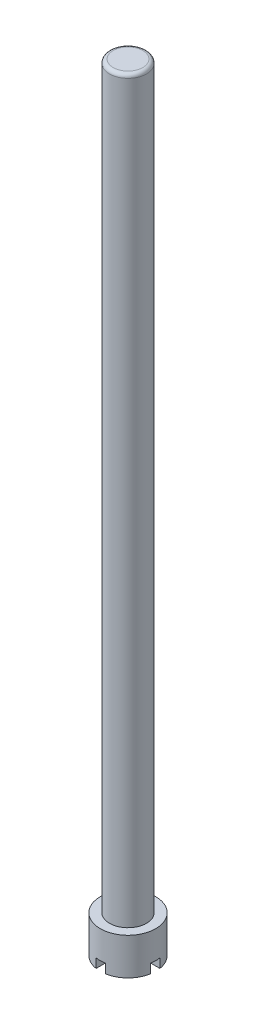
ISO-10303-21;
HEADER;
FILE_DESCRIPTION(('STEP AP214'),'2;1');
FILE_NAME('part.step','',(''),(''),'','','');
FILE_SCHEMA(('AUTOMOTIVE_DESIGN { 1 0 10303 214 1 1 1 1 }'));
ENDSEC;
DATA;
#1=APPLICATION_CONTEXT('core data for automotive mechanical design processes');
#2=APPLICATION_PROTOCOL_DEFINITION('international standard','automotive_design',2000,#1);
#3=PRODUCT_CONTEXT('',#1,'mechanical');
#4=PRODUCT('Part','Part','',(#3));
#5=PRODUCT_RELATED_PRODUCT_CATEGORY('part','',(#4));
#6=PRODUCT_DEFINITION_FORMATION('','',#4);
#7=PRODUCT_DEFINITION_CONTEXT('part definition',#1,'design');
#8=PRODUCT_DEFINITION('design','',#6,#7);
#9=PRODUCT_DEFINITION_SHAPE('','',#8);
#10=(LENGTH_UNIT() NAMED_UNIT(*) SI_UNIT(.MILLI.,.METRE.));
#11=(NAMED_UNIT(*) PLANE_ANGLE_UNIT() SI_UNIT($,.RADIAN.));
#12=(NAMED_UNIT(*) SI_UNIT($,.STERADIAN.) SOLID_ANGLE_UNIT());
#13=UNCERTAINTY_MEASURE_WITH_UNIT(LENGTH_MEASURE(1.E-05),#10,'distance_accuracy_value','');
#14=(GEOMETRIC_REPRESENTATION_CONTEXT(3) GLOBAL_UNCERTAINTY_ASSIGNED_CONTEXT((#13)) GLOBAL_UNIT_ASSIGNED_CONTEXT((#10,
#11,#12)) REPRESENTATION_CONTEXT('',''));
#15=CARTESIAN_POINT('',(0.,0.,0.));
#16=DIRECTION('',(0.,0.,1.));
#17=DIRECTION('',(1.,0.,0.));
#18=AXIS2_PLACEMENT_3D('',#15,#16,#17);
#19=CARTESIAN_POINT('',(0.,-0.75,0.));
#20=DIRECTION('',(0.,-1.,0.));
#21=DIRECTION('',(0.,0.,-1.));
#22=AXIS2_PLACEMENT_3D('',#19,#20,#21);
#23=PLANE('',#22);
#24=CARTESIAN_POINT('',(0.,-0.75,0.));
#25=DIRECTION('',(0.,-1.,0.));
#26=DIRECTION('',(0.,0.,-1.));
#27=AXIS2_PLACEMENT_3D('',#24,#25,#26);
#28=CIRCLE('',#27,0.25);
#29=CARTESIAN_POINT('',(0.21650635094611,-0.75,-0.125));
#30=VERTEX_POINT('',#29);
#31=CARTESIAN_POINT('',(0.21650635094611,-0.75,0.125));
#32=VERTEX_POINT('',#31);
#33=EDGE_CURVE('E162',#30,#32,#28,.T.);
#34=ORIENTED_EDGE('',*,*,#33,.F.);
#35=DIRECTION('',(-1.,0.,0.));
#36=VECTOR('',#35,1.);
#37=CARTESIAN_POINT('',(0.87546783339079,-0.75,-0.125));
#38=LINE('',#37,#36);
#39=CARTESIAN_POINT('',(0.739509972887452,-0.75,-0.125));
#40=VERTEX_POINT('',#39);
#41=EDGE_CURVE('E175',#40,#30,#38,.T.);
#42=ORIENTED_EDGE('',*,*,#41,.F.);
#43=CARTESIAN_POINT('',(0.,-0.75,0.));
#44=DIRECTION('',(0.,-1.,0.));
#45=DIRECTION('',(0.,0.,-1.));
#46=AXIS2_PLACEMENT_3D('',#43,#44,#45);
#47=CIRCLE('',#46,0.75);
#48=CARTESIAN_POINT('',(0.739509972887452,-0.75,0.125));
#49=VERTEX_POINT('',#48);
#50=EDGE_CURVE('E256',#40,#49,#47,.T.);
#51=ORIENTED_EDGE('',*,*,#50,.T.);
#52=DIRECTION('',(-1.,0.,0.));
#53=VECTOR('',#52,1.);
#54=CARTESIAN_POINT('',(0.87546783339079,-0.75,0.125));
#55=LINE('',#54,#53);
#56=EDGE_CURVE('E178',#49,#32,#55,.T.);
#57=ORIENTED_EDGE('',*,*,#56,.T.);
#58=EDGE_LOOP('',(#34,#42,#51,#57));
#59=FACE_BOUND('',#58,.T.);
#60=ADVANCED_FACE('F34',(#59),#23,.T.);
#61=CARTESIAN_POINT('',(0.125,-0.75,0.21650635094611));
#62=VERTEX_POINT('',#61);
#63=CARTESIAN_POINT('',(-0.125,-0.75,0.21650635094611));
#64=VERTEX_POINT('',#63);
#65=EDGE_CURVE('E369',#62,#64,#28,.T.);
#66=ORIENTED_EDGE('',*,*,#65,.F.);
#67=DIRECTION('',(0.,0.,1.));
#68=VECTOR('',#67,1.);
#69=CARTESIAN_POINT('',(0.125,-0.75,0.125));
#70=LINE('',#69,#68);
#71=CARTESIAN_POINT('',(0.125,-0.75,0.739509972887452));
#72=VERTEX_POINT('',#71);
#73=EDGE_CURVE('E192',#62,#72,#70,.T.);
#74=ORIENTED_EDGE('',*,*,#73,.T.);
#75=CARTESIAN_POINT('',(-0.125,-0.75,0.739509972887452));
#76=VERTEX_POINT('',#75);
#77=EDGE_CURVE('E325',#72,#76,#47,.T.);
#78=ORIENTED_EDGE('',*,*,#77,.T.);
#79=DIRECTION('',(0.,0.,1.));
#80=VECTOR('',#79,1.);
#81=CARTESIAN_POINT('',(-0.125,-0.75,0.125));
#82=LINE('',#81,#80);
#83=EDGE_CURVE('E57',#64,#76,#82,.T.);
#84=ORIENTED_EDGE('',*,*,#83,.F.);
#85=EDGE_LOOP('',(#66,#74,#78,#84));
#86=FACE_BOUND('',#85,.T.);
#87=ADVANCED_FACE('F273',(#86),#23,.T.);
#88=CARTESIAN_POINT('',(-0.21650635094611,-0.75,0.125));
#89=VERTEX_POINT('',#88);
#90=CARTESIAN_POINT('',(-0.21650635094611,-0.75,-0.125));
#91=VERTEX_POINT('',#90);
#92=EDGE_CURVE('E307',#89,#91,#28,.T.);
#93=ORIENTED_EDGE('',*,*,#92,.F.);
#94=DIRECTION('',(-1.,0.,0.));
#95=VECTOR('',#94,1.);
#96=CARTESIAN_POINT('',(-0.125,-0.75,0.125));
#97=LINE('',#96,#95);
#98=CARTESIAN_POINT('',(-0.739509972887452,-0.75,0.125));
#99=VERTEX_POINT('',#98);
#100=EDGE_CURVE('E200',#89,#99,#97,.T.);
#101=ORIENTED_EDGE('',*,*,#100,.T.);
#102=CARTESIAN_POINT('',(-0.739509972887452,-0.75,-0.125));
#103=VERTEX_POINT('',#102);
#104=EDGE_CURVE('E255',#99,#103,#47,.T.);
#105=ORIENTED_EDGE('',*,*,#104,.T.);
#106=DIRECTION('',(-1.,0.,0.));
#107=VECTOR('',#106,1.);
#108=CARTESIAN_POINT('',(-0.125,-0.75,-0.125));
#109=LINE('',#108,#107);
#110=EDGE_CURVE('E198',#91,#103,#109,.T.);
#111=ORIENTED_EDGE('',*,*,#110,.F.);
#112=EDGE_LOOP('',(#93,#101,#105,#111));
#113=FACE_BOUND('',#112,.T.);
#114=ADVANCED_FACE('F279',(#113),#23,.T.);
#115=CARTESIAN_POINT('',(0.,-1.,0.));
#116=DIRECTION('',(0.,1.,0.));
#117=DIRECTION('',(0.,0.,1.));
#118=AXIS2_PLACEMENT_3D('',#115,#116,#117);
#119=CYLINDRICAL_SURFACE('',#118,0.75);
#120=CARTESIAN_POINT('',(0.,0.,0.));
#121=DIRECTION('',(0.,-1.,0.));
#122=DIRECTION('',(0.,0.,-1.));
#123=AXIS2_PLACEMENT_3D('',#120,#121,#122);
#124=CIRCLE('',#123,0.75);
#125=CARTESIAN_POINT('',(0.,0.,-0.75));
#126=VERTEX_POINT('',#125);
#127=EDGE_CURVE('E231',#126,#126,#124,.T.);
#128=ORIENTED_EDGE('',*,*,#127,.T.);
#129=EDGE_LOOP('',(#128));
#130=FACE_BOUND('',#129,.T.);
#131=CARTESIAN_POINT('',(0.,-1.,0.));
#132=DIRECTION('',(0.,-1.,0.));
#133=DIRECTION('',(0.,0.,-1.));
#134=AXIS2_PLACEMENT_3D('',#131,#132,#133);
#135=CIRCLE('',#134,0.75);
#136=CARTESIAN_POINT('',(0.739509972887452,-1.,0.125));
#137=VERTEX_POINT('',#136);
#138=CARTESIAN_POINT('',(0.125,-1.,0.739509972887452));
#139=VERTEX_POINT('',#138);
#140=EDGE_CURVE('E236',#137,#139,#135,.T.);
#141=ORIENTED_EDGE('',*,*,#140,.F.);
#142=DIRECTION('',(0.,1.,0.));
#143=VECTOR('',#142,1.);
#144=CARTESIAN_POINT('',(0.739509972887452,-1.,0.125));
#145=LINE('',#144,#143);
#146=EDGE_CURVE('E223',#137,#49,#145,.T.);
#147=ORIENTED_EDGE('',*,*,#146,.T.);
#148=ORIENTED_EDGE('',*,*,#50,.F.);
#149=DIRECTION('',(0.,1.,0.));
#150=VECTOR('',#149,1.);
#151=CARTESIAN_POINT('',(0.739509972887452,-1.,-0.125));
#152=LINE('',#151,#150);
#153=CARTESIAN_POINT('',(0.739509972887452,-1.,-0.125));
#154=VERTEX_POINT('',#153);
#155=EDGE_CURVE('E186',#154,#40,#152,.T.);
#156=ORIENTED_EDGE('',*,*,#155,.F.);
#157=CARTESIAN_POINT('',(0.125,-1.,-0.739509972887452));
#158=VERTEX_POINT('',#157);
#159=EDGE_CURVE('E232',#158,#154,#135,.T.);
#160=ORIENTED_EDGE('',*,*,#159,.F.);
#161=DIRECTION('',(0.,1.,0.));
#162=VECTOR('',#161,1.);
#163=CARTESIAN_POINT('',(0.125,-1.,-0.739509972887452));
#164=LINE('',#163,#162);
#165=CARTESIAN_POINT('',(0.125,-0.75,-0.739509972887452));
#166=VERTEX_POINT('',#165);
#167=EDGE_CURVE('E219',#158,#166,#164,.T.);
#168=ORIENTED_EDGE('',*,*,#167,.T.);
#169=CARTESIAN_POINT('',(-0.125,-0.75,-0.739509972887452));
#170=VERTEX_POINT('',#169);
#171=EDGE_CURVE('E253',#170,#166,#47,.T.);
#172=ORIENTED_EDGE('',*,*,#171,.F.);
#173=DIRECTION('',(0.,1.,0.));
#174=VECTOR('',#173,1.);
#175=CARTESIAN_POINT('',(-0.125,-1.,-0.739509972887452));
#176=LINE('',#175,#174);
#177=CARTESIAN_POINT('',(-0.125,-1.,-0.739509972887452));
#178=VERTEX_POINT('',#177);
#179=EDGE_CURVE('E217',#178,#170,#176,.T.);
#180=ORIENTED_EDGE('',*,*,#179,.F.);
#181=CARTESIAN_POINT('',(-0.739509972887452,-1.,-0.125));
#182=VERTEX_POINT('',#181);
#183=EDGE_CURVE('E237',#182,#178,#135,.T.);
#184=ORIENTED_EDGE('',*,*,#183,.F.);
#185=DIRECTION('',(0.,1.,0.));
#186=VECTOR('',#185,1.);
#187=CARTESIAN_POINT('',(-0.739509972887452,-1.,-0.125));
#188=LINE('',#187,#186);
#189=EDGE_CURVE('E214',#103,#182,#188,.F.);
#190=ORIENTED_EDGE('',*,*,#189,.F.);
#191=ORIENTED_EDGE('',*,*,#104,.F.);
#192=DIRECTION('',(0.,1.,0.));
#193=VECTOR('',#192,1.);
#194=CARTESIAN_POINT('',(-0.739509972887452,-1.,0.125));
#195=LINE('',#194,#193);
#196=CARTESIAN_POINT('',(-0.739509972887452,-1.,0.125));
#197=VERTEX_POINT('',#196);
#198=EDGE_CURVE('E202',#99,#197,#195,.F.);
#199=ORIENTED_EDGE('',*,*,#198,.T.);
#200=CARTESIAN_POINT('',(-0.125,-1.,0.739509972887452));
#201=VERTEX_POINT('',#200);
#202=EDGE_CURVE('E336',#201,#197,#135,.T.);
#203=ORIENTED_EDGE('',*,*,#202,.F.);
#204=DIRECTION('',(0.,1.,0.));
#205=VECTOR('',#204,1.);
#206=CARTESIAN_POINT('',(-0.125,-1.,0.739509972887452));
#207=LINE('',#206,#205);
#208=EDGE_CURVE('E229',#76,#201,#207,.F.);
#209=ORIENTED_EDGE('',*,*,#208,.F.);
#210=ORIENTED_EDGE('',*,*,#77,.F.);
#211=DIRECTION('',(0.,1.,0.));
#212=VECTOR('',#211,1.);
#213=CARTESIAN_POINT('',(0.125,-1.,0.739509972887452));
#214=LINE('',#213,#212);
#215=EDGE_CURVE('E226',#72,#139,#214,.F.);
#216=ORIENTED_EDGE('',*,*,#215,.T.);
#217=EDGE_LOOP('',(#141,#147,#148,#156,#160,#168,#172,#180,#184,#190,#191,#199,#203,#209,#210,#216));
#218=FACE_BOUND('',#217,.T.);
#219=ADVANCED_FACE('F296',(#130,#218),#119,.T.);
#220=CARTESIAN_POINT('',(0.,-1.,0.));
#221=DIRECTION('',(0.,-1.,0.));
#222=DIRECTION('',(0.,0.,-1.));
#223=AXIS2_PLACEMENT_3D('',#220,#221,#222);
#224=PLANE('',#223);
#225=CARTESIAN_POINT('',(0.,-1.,0.));
#226=DIRECTION('',(0.,-1.,0.));
#227=DIRECTION('',(0.,0.,-1.));
#228=AXIS2_PLACEMENT_3D('',#225,#226,#227);
#229=CIRCLE('',#228,0.25);
#230=CARTESIAN_POINT('',(0.125,-1.,-0.21650635094611));
#231=VERTEX_POINT('',#230);
#232=CARTESIAN_POINT('',(0.21650635094611,-1.,-0.125));
#233=VERTEX_POINT('',#232);
#234=EDGE_CURVE('E351',#231,#233,#229,.T.);
#235=ORIENTED_EDGE('',*,*,#234,.F.);
#236=DIRECTION('',(0.,0.,1.));
#237=VECTOR('',#236,1.);
#238=CARTESIAN_POINT('',(0.125,-1.,0.));
#239=LINE('',#238,#237);
#240=EDGE_CURVE('E245',#158,#231,#239,.T.);
#241=ORIENTED_EDGE('',*,*,#240,.F.);
#242=ORIENTED_EDGE('',*,*,#159,.T.);
#243=DIRECTION('',(-1.,0.,0.));
#244=VECTOR('',#243,1.);
#245=CARTESIAN_POINT('',(0.,-1.,-0.125));
#246=LINE('',#245,#244);
#247=EDGE_CURVE('E248',#154,#233,#246,.T.);
#248=ORIENTED_EDGE('',*,*,#247,.T.);
#249=EDGE_LOOP('',(#235,#241,#242,#248));
#250=FACE_BOUND('',#249,.T.);
#251=ADVANCED_FACE('F301',(#250),#224,.T.);
#252=CARTESIAN_POINT('',(-0.21650635094611,-1.,-0.125));
#253=VERTEX_POINT('',#252);
#254=CARTESIAN_POINT('',(-0.125,-1.,-0.21650635094611));
#255=VERTEX_POINT('',#254);
#256=EDGE_CURVE('E169',#253,#255,#229,.T.);
#257=ORIENTED_EDGE('',*,*,#256,.F.);
#258=DIRECTION('',(-1.,0.,0.));
#259=VECTOR('',#258,1.);
#260=CARTESIAN_POINT('',(-0.125,-1.,-0.125));
#261=LINE('',#260,#259);
#262=EDGE_CURVE('E208',#253,#182,#261,.T.);
#263=ORIENTED_EDGE('',*,*,#262,.T.);
#264=ORIENTED_EDGE('',*,*,#183,.T.);
#265=DIRECTION('',(0.,0.,1.));
#266=VECTOR('',#265,1.);
#267=CARTESIAN_POINT('',(-0.125,-1.,0.));
#268=LINE('',#267,#266);
#269=EDGE_CURVE('E242',#178,#255,#268,.T.);
#270=ORIENTED_EDGE('',*,*,#269,.T.);
#271=EDGE_LOOP('',(#257,#263,#264,#270));
#272=FACE_BOUND('',#271,.T.);
#273=ADVANCED_FACE('F341',(#272),#224,.T.);
#274=CARTESIAN_POINT('',(-0.125,-1.,0.21650635094611));
#275=VERTEX_POINT('',#274);
#276=CARTESIAN_POINT('',(-0.21650635094611,-1.,0.125));
#277=VERTEX_POINT('',#276);
#278=EDGE_CURVE('E49',#275,#277,#229,.T.);
#279=ORIENTED_EDGE('',*,*,#278,.F.);
#280=DIRECTION('',(0.,0.,1.));
#281=VECTOR('',#280,1.);
#282=CARTESIAN_POINT('',(-0.125,-1.,0.125));
#283=LINE('',#282,#281);
#284=EDGE_CURVE('E203',#275,#201,#283,.T.);
#285=ORIENTED_EDGE('',*,*,#284,.T.);
#286=ORIENTED_EDGE('',*,*,#202,.T.);
#287=DIRECTION('',(-1.,0.,0.));
#288=VECTOR('',#287,1.);
#289=CARTESIAN_POINT('',(-0.125,-1.,0.125));
#290=LINE('',#289,#288);
#291=EDGE_CURVE('E210',#277,#197,#290,.T.);
#292=ORIENTED_EDGE('',*,*,#291,.F.);
#293=EDGE_LOOP('',(#279,#285,#286,#292));
#294=FACE_BOUND('',#293,.T.);
#295=ADVANCED_FACE('F372',(#294),#224,.T.);
#296=CARTESIAN_POINT('',(0.,20.,0.));
#297=DIRECTION('',(0.,-1.,0.));
#298=DIRECTION('',(0.,0.,-1.));
#299=AXIS2_PLACEMENT_3D('',#296,#297,#298);
#300=CYLINDRICAL_SURFACE('',#299,0.5);
#301=CARTESIAN_POINT('',(0.,19.9,0.));
#302=DIRECTION('',(0.,1.,0.));
#303=DIRECTION('',(0.,0.,1.));
#304=AXIS2_PLACEMENT_3D('',#301,#302,#303);
#305=CIRCLE('',#304,0.5);
#306=CARTESIAN_POINT('',(0.,19.9,0.5));
#307=VERTEX_POINT('',#306);
#308=EDGE_CURVE('E11',#307,#307,#305,.F.);
#309=ORIENTED_EDGE('',*,*,#308,.T.);
#310=EDGE_LOOP('',(#309));
#311=FACE_BOUND('',#310,.T.);
#312=CARTESIAN_POINT('',(0.,0.,0.));
#313=DIRECTION('',(0.,1.,0.));
#314=DIRECTION('',(0.,0.,1.));
#315=AXIS2_PLACEMENT_3D('',#312,#313,#314);
#316=CIRCLE('',#315,0.5);
#317=CARTESIAN_POINT('',(0.,0.,0.5));
#318=VERTEX_POINT('',#317);
#319=EDGE_CURVE('E235',#318,#318,#316,.T.);
#320=ORIENTED_EDGE('',*,*,#319,.T.);
#321=EDGE_LOOP('',(#320));
#322=FACE_BOUND('',#321,.T.);
#323=ADVANCED_FACE('F396',(#311,#322),#300,.T.);
#324=CARTESIAN_POINT('',(0.,20.,0.));
#325=DIRECTION('',(0.,1.,0.));
#326=DIRECTION('',(0.,0.,1.));
#327=AXIS2_PLACEMENT_3D('',#324,#325,#326);
#328=PLANE('',#327);
#329=CARTESIAN_POINT('',(0.,20.,0.));
#330=DIRECTION('',(0.,1.,0.));
#331=DIRECTION('',(0.,0.,1.));
#332=AXIS2_PLACEMENT_3D('',#329,#330,#331);
#333=CIRCLE('',#332,0.4);
#334=CARTESIAN_POINT('',(0.,20.,0.4));
#335=VERTEX_POINT('',#334);
#336=EDGE_CURVE('E42',#335,#335,#333,.T.);
#337=ORIENTED_EDGE('',*,*,#336,.T.);
#338=EDGE_LOOP('',(#337));
#339=FACE_BOUND('',#338,.T.);
#340=ADVANCED_FACE('F261',(#339),#328,.T.);
#341=CARTESIAN_POINT('',(0.21650635094611,-1.,0.125));
#342=VERTEX_POINT('',#341);
#343=CARTESIAN_POINT('',(0.125,-1.,0.21650635094611));
#344=VERTEX_POINT('',#343);
#345=EDGE_CURVE('E354',#342,#344,#229,.T.);
#346=ORIENTED_EDGE('',*,*,#345,.F.);
#347=DIRECTION('',(-1.,0.,0.));
#348=VECTOR('',#347,1.);
#349=CARTESIAN_POINT('',(0.,-1.,0.125));
#350=LINE('',#349,#348);
#351=EDGE_CURVE('E250',#137,#342,#350,.T.);
#352=ORIENTED_EDGE('',*,*,#351,.F.);
#353=ORIENTED_EDGE('',*,*,#140,.T.);
#354=DIRECTION('',(0.,0.,1.));
#355=VECTOR('',#354,1.);
#356=CARTESIAN_POINT('',(0.125,-1.,0.125));
#357=LINE('',#356,#355);
#358=EDGE_CURVE('E205',#344,#139,#357,.T.);
#359=ORIENTED_EDGE('',*,*,#358,.F.);
#360=EDGE_LOOP('',(#346,#352,#353,#359));
#361=FACE_BOUND('',#360,.T.);
#362=ADVANCED_FACE('F292',(#361),#224,.T.);
#363=CARTESIAN_POINT('',(0.,0.,0.));
#364=DIRECTION('',(0.,-1.,0.));
#365=DIRECTION('',(0.,0.,-1.));
#366=AXIS2_PLACEMENT_3D('',#363,#364,#365);
#367=PLANE('',#366);
#368=ORIENTED_EDGE('',*,*,#319,.F.);
#369=EDGE_LOOP('',(#368));
#370=FACE_BOUND('',#369,.T.);
#371=ORIENTED_EDGE('',*,*,#127,.F.);
#372=EDGE_LOOP('',(#371));
#373=FACE_BOUND('',#372,.T.);
#374=ADVANCED_FACE('F284',(#370,#373),#367,.F.);
#375=CARTESIAN_POINT('',(-0.125,-0.75,-0.21650635094611));
#376=VERTEX_POINT('',#375);
#377=CARTESIAN_POINT('',(0.125,-0.75,-0.21650635094611));
#378=VERTEX_POINT('',#377);
#379=EDGE_CURVE('E166',#376,#378,#28,.T.);
#380=ORIENTED_EDGE('',*,*,#379,.F.);
#381=DIRECTION('',(0.,0.,1.));
#382=VECTOR('',#381,1.);
#383=CARTESIAN_POINT('',(-0.125,-0.75,-0.835149175207411));
#384=LINE('',#383,#382);
#385=EDGE_CURVE('E190',#170,#376,#384,.T.);
#386=ORIENTED_EDGE('',*,*,#385,.F.);
#387=ORIENTED_EDGE('',*,*,#171,.T.);
#388=DIRECTION('',(0.,0.,1.));
#389=VECTOR('',#388,1.);
#390=CARTESIAN_POINT('',(0.125,-0.75,-0.835149175207411));
#391=LINE('',#390,#389);
#392=EDGE_CURVE('E187',#166,#378,#391,.T.);
#393=ORIENTED_EDGE('',*,*,#392,.T.);
#394=EDGE_LOOP('',(#380,#386,#387,#393));
#395=FACE_BOUND('',#394,.T.);
#396=ADVANCED_FACE('F275',(#395),#23,.T.);
#397=CARTESIAN_POINT('',(-0.125,-0.75,0.125));
#398=DIRECTION('',(1.,0.,0.));
#399=DIRECTION('',(0.,0.,-1.));
#400=AXIS2_PLACEMENT_3D('',#397,#398,#399);
#401=PLANE('',#400);
#402=DIRECTION('',(0.,-1.,0.));
#403=VECTOR('',#402,1.);
#404=CARTESIAN_POINT('',(-0.125,-0.659007441433451,0.21650635094611));
#405=LINE('',#404,#403);
#406=EDGE_CURVE('E206',#64,#275,#405,.T.);
#407=ORIENTED_EDGE('',*,*,#406,.F.);
#408=ORIENTED_EDGE('',*,*,#83,.T.);
#409=ORIENTED_EDGE('',*,*,#208,.T.);
#410=ORIENTED_EDGE('',*,*,#284,.F.);
#411=EDGE_LOOP('',(#407,#408,#409,#410));
#412=FACE_BOUND('',#411,.T.);
#413=ADVANCED_FACE('F283',(#412),#401,.T.);
#414=CARTESIAN_POINT('',(0.125,-0.75,0.125));
#415=DIRECTION('',(1.,0.,0.));
#416=DIRECTION('',(0.,0.,-1.));
#417=AXIS2_PLACEMENT_3D('',#414,#415,#416);
#418=PLANE('',#417);
#419=ORIENTED_EDGE('',*,*,#73,.F.);
#420=DIRECTION('',(0.,-1.,0.));
#421=VECTOR('',#420,1.);
#422=CARTESIAN_POINT('',(0.125,-0.659007441433451,0.21650635094611));
#423=LINE('',#422,#421);
#424=EDGE_CURVE('E362',#62,#344,#423,.T.);
#425=ORIENTED_EDGE('',*,*,#424,.T.);
#426=ORIENTED_EDGE('',*,*,#358,.T.);
#427=ORIENTED_EDGE('',*,*,#215,.F.);
#428=EDGE_LOOP('',(#419,#425,#426,#427));
#429=FACE_BOUND('',#428,.T.);
#430=ADVANCED_FACE('F290',(#429),#418,.F.);
#431=CARTESIAN_POINT('',(0.87546783339079,-0.75,0.125));
#432=DIRECTION('',(0.,0.,1.));
#433=DIRECTION('',(1.,0.,0.));
#434=AXIS2_PLACEMENT_3D('',#431,#432,#433);
#435=PLANE('',#434);
#436=ORIENTED_EDGE('',*,*,#351,.T.);
#437=DIRECTION('',(0.,-1.,0.));
#438=VECTOR('',#437,1.);
#439=CARTESIAN_POINT('',(0.21650635094611,-0.659007441433451,0.125));
#440=LINE('',#439,#438);
#441=EDGE_CURVE('E331',#342,#32,#440,.F.);
#442=ORIENTED_EDGE('',*,*,#441,.T.);
#443=ORIENTED_EDGE('',*,*,#56,.F.);
#444=ORIENTED_EDGE('',*,*,#146,.F.);
#445=EDGE_LOOP('',(#436,#442,#443,#444));
#446=FACE_BOUND('',#445,.T.);
#447=ADVANCED_FACE('F329',(#446),#435,.F.);
#448=CARTESIAN_POINT('',(0.87546783339079,-0.75,-0.125));
#449=DIRECTION('',(0.,0.,1.));
#450=DIRECTION('',(1.,0.,0.));
#451=AXIS2_PLACEMENT_3D('',#448,#449,#450);
#452=PLANE('',#451);
#453=DIRECTION('',(0.,-1.,0.));
#454=VECTOR('',#453,1.);
#455=CARTESIAN_POINT('',(0.21650635094611,-0.659007441433451,-0.125));
#456=LINE('',#455,#454);
#457=EDGE_CURVE('E183',#233,#30,#456,.F.);
#458=ORIENTED_EDGE('',*,*,#457,.F.);
#459=ORIENTED_EDGE('',*,*,#247,.F.);
#460=ORIENTED_EDGE('',*,*,#155,.T.);
#461=ORIENTED_EDGE('',*,*,#41,.T.);
#462=EDGE_LOOP('',(#458,#459,#460,#461));
#463=FACE_BOUND('',#462,.T.);
#464=ADVANCED_FACE('F182',(#463),#452,.T.);
#465=CARTESIAN_POINT('',(0.125,-0.75,-0.835149175207411));
#466=DIRECTION('',(1.,0.,0.));
#467=DIRECTION('',(0.,0.,-1.));
#468=AXIS2_PLACEMENT_3D('',#465,#466,#467);
#469=PLANE('',#468);
#470=ORIENTED_EDGE('',*,*,#240,.T.);
#471=DIRECTION('',(0.,-1.,0.));
#472=VECTOR('',#471,1.);
#473=CARTESIAN_POINT('',(0.125,-0.659007441433451,-0.21650635094611));
#474=LINE('',#473,#472);
#475=EDGE_CURVE('E358',#231,#378,#474,.F.);
#476=ORIENTED_EDGE('',*,*,#475,.T.);
#477=ORIENTED_EDGE('',*,*,#392,.F.);
#478=ORIENTED_EDGE('',*,*,#167,.F.);
#479=EDGE_LOOP('',(#470,#476,#477,#478));
#480=FACE_BOUND('',#479,.T.);
#481=ADVANCED_FACE('F381',(#480),#469,.F.);
#482=CARTESIAN_POINT('',(-0.125,-0.75,-0.835149175207411));
#483=DIRECTION('',(1.,0.,0.));
#484=DIRECTION('',(0.,0.,-1.));
#485=AXIS2_PLACEMENT_3D('',#482,#483,#484);
#486=PLANE('',#485);
#487=DIRECTION('',(0.,-1.,0.));
#488=VECTOR('',#487,1.);
#489=CARTESIAN_POINT('',(-0.125,-0.659007441433451,-0.21650635094611));
#490=LINE('',#489,#488);
#491=EDGE_CURVE('E356',#255,#376,#490,.F.);
#492=ORIENTED_EDGE('',*,*,#491,.F.);
#493=ORIENTED_EDGE('',*,*,#269,.F.);
#494=ORIENTED_EDGE('',*,*,#179,.T.);
#495=ORIENTED_EDGE('',*,*,#385,.T.);
#496=EDGE_LOOP('',(#492,#493,#494,#495));
#497=FACE_BOUND('',#496,.T.);
#498=ADVANCED_FACE('F348',(#497),#486,.T.);
#499=CARTESIAN_POINT('',(-0.125,-0.75,-0.125));
#500=DIRECTION('',(0.,0.,1.));
#501=DIRECTION('',(1.,0.,0.));
#502=AXIS2_PLACEMENT_3D('',#499,#500,#501);
#503=PLANE('',#502);
#504=DIRECTION('',(0.,-1.,0.));
#505=VECTOR('',#504,1.);
#506=CARTESIAN_POINT('',(-0.21650635094611,-0.659007441433451,-0.125));
#507=LINE('',#506,#505);
#508=EDGE_CURVE('E353',#91,#253,#507,.T.);
#509=ORIENTED_EDGE('',*,*,#508,.F.);
#510=ORIENTED_EDGE('',*,*,#110,.T.);
#511=ORIENTED_EDGE('',*,*,#189,.T.);
#512=ORIENTED_EDGE('',*,*,#262,.F.);
#513=EDGE_LOOP('',(#509,#510,#511,#512));
#514=FACE_BOUND('',#513,.T.);
#515=ADVANCED_FACE('F374',(#514),#503,.T.);
#516=CARTESIAN_POINT('',(-0.125,-0.75,0.125));
#517=DIRECTION('',(0.,0.,1.));
#518=DIRECTION('',(1.,0.,0.));
#519=AXIS2_PLACEMENT_3D('',#516,#517,#518);
#520=PLANE('',#519);
#521=ORIENTED_EDGE('',*,*,#100,.F.);
#522=DIRECTION('',(0.,-1.,0.));
#523=VECTOR('',#522,1.);
#524=CARTESIAN_POINT('',(-0.21650635094611,-0.659007441433451,0.125));
#525=LINE('',#524,#523);
#526=EDGE_CURVE('E257',#89,#277,#525,.T.);
#527=ORIENTED_EDGE('',*,*,#526,.T.);
#528=ORIENTED_EDGE('',*,*,#291,.T.);
#529=ORIENTED_EDGE('',*,*,#198,.F.);
#530=EDGE_LOOP('',(#521,#527,#528,#529));
#531=FACE_BOUND('',#530,.T.);
#532=ADVANCED_FACE('F316',(#531),#520,.F.);
#533=CARTESIAN_POINT('',(0.,-0.659007441433451,0.));
#534=DIRECTION('',(0.,-1.,0.));
#535=DIRECTION('',(0.,0.,-1.));
#536=AXIS2_PLACEMENT_3D('',#533,#534,#535);
#537=CYLINDRICAL_SURFACE('',#536,0.25);
#538=EDGE_CURVE('E179',#32,#62,#28,.T.);
#539=ORIENTED_EDGE('',*,*,#538,.F.);
#540=ORIENTED_EDGE('',*,*,#441,.F.);
#541=ORIENTED_EDGE('',*,*,#345,.T.);
#542=ORIENTED_EDGE('',*,*,#424,.F.);
#543=EDGE_LOOP('',(#539,#540,#541,#542));
#544=FACE_BOUND('',#543,.T.);
#545=ADVANCED_FACE('F270',(#544),#537,.F.);
#546=ORIENTED_EDGE('',*,*,#406,.T.);
#547=ORIENTED_EDGE('',*,*,#278,.T.);
#548=ORIENTED_EDGE('',*,*,#526,.F.);
#549=EDGE_CURVE('E313',#64,#89,#28,.T.);
#550=ORIENTED_EDGE('',*,*,#549,.F.);
#551=EDGE_LOOP('',(#546,#547,#548,#550));
#552=FACE_BOUND('',#551,.T.);
#553=ADVANCED_FACE('F419',(#552),#537,.F.);
#554=ORIENTED_EDGE('',*,*,#457,.T.);
#555=EDGE_CURVE('E159',#378,#30,#28,.T.);
#556=ORIENTED_EDGE('',*,*,#555,.F.);
#557=ORIENTED_EDGE('',*,*,#475,.F.);
#558=ORIENTED_EDGE('',*,*,#234,.T.);
#559=EDGE_LOOP('',(#554,#556,#557,#558));
#560=FACE_BOUND('',#559,.T.);
#561=ADVANCED_FACE('F154',(#560),#537,.F.);
#562=CARTESIAN_POINT('',(0.,-0.75,0.));
#563=DIRECTION('',(0.,-1.,0.));
#564=DIRECTION('',(0.,0.,-1.));
#565=AXIS2_PLACEMENT_3D('',#562,#563,#564);
#566=CONICAL_SURFACE('',#565,0.25,1.22173047639604);
#567=CARTESIAN_POINT('',(0.,-0.659007441433451,0.));
#568=VERTEX_POINT('',#567);
#569=VERTEX_LOOP('',#568);
#570=FACE_BOUND('',#569,.T.);
#571=ORIENTED_EDGE('',*,*,#555,.T.);
#572=ORIENTED_EDGE('',*,*,#33,.T.);
#573=ORIENTED_EDGE('',*,*,#538,.T.);
#574=ORIENTED_EDGE('',*,*,#65,.T.);
#575=ORIENTED_EDGE('',*,*,#549,.T.);
#576=ORIENTED_EDGE('',*,*,#92,.T.);
#577=EDGE_CURVE('E314',#91,#376,#28,.T.);
#578=ORIENTED_EDGE('',*,*,#577,.T.);
#579=ORIENTED_EDGE('',*,*,#379,.T.);
#580=EDGE_LOOP('',(#571,#572,#573,#574,#575,#576,#578,#579));
#581=FACE_BOUND('',#580,.T.);
#582=ADVANCED_FACE('F150',(#570,#581),#566,.F.);
#583=ORIENTED_EDGE('',*,*,#491,.T.);
#584=ORIENTED_EDGE('',*,*,#577,.F.);
#585=ORIENTED_EDGE('',*,*,#508,.T.);
#586=ORIENTED_EDGE('',*,*,#256,.T.);
#587=EDGE_LOOP('',(#583,#584,#585,#586));
#588=FACE_BOUND('',#587,.T.);
#589=ADVANCED_FACE('F153',(#588),#537,.F.);
#590=CARTESIAN_POINT('',(0.,19.9,0.));
#591=DIRECTION('',(0.,1.,0.));
#592=DIRECTION('',(0.,0.,1.));
#593=AXIS2_PLACEMENT_3D('',#590,#591,#592);
#594=TOROIDAL_SURFACE('',#593,0.4,0.1);
#595=ORIENTED_EDGE('',*,*,#308,.F.);
#596=EDGE_LOOP('',(#595));
#597=FACE_BOUND('',#596,.T.);
#598=ORIENTED_EDGE('',*,*,#336,.F.);
#599=EDGE_LOOP('',(#598));
#600=FACE_BOUND('',#599,.T.);
#601=ADVANCED_FACE('F36',(#597,#600),#594,.T.);
#602=CLOSED_SHELL('',(#60,#87,#114,#219,#251,#273,#295,#323,#340,#362,#374,#396,#413,#430,#447,
#464,#481,#498,#515,#532,#545,#553,#561,#582,#589,#601));
#603=MANIFOLD_SOLID_BREP('B2',#602);
#604=ADVANCED_BREP_SHAPE_REPRESENTATION('',(#18,#603),#14);
#605=SHAPE_DEFINITION_REPRESENTATION(#9,#604);
ENDSEC;
END-ISO-10303-21;
